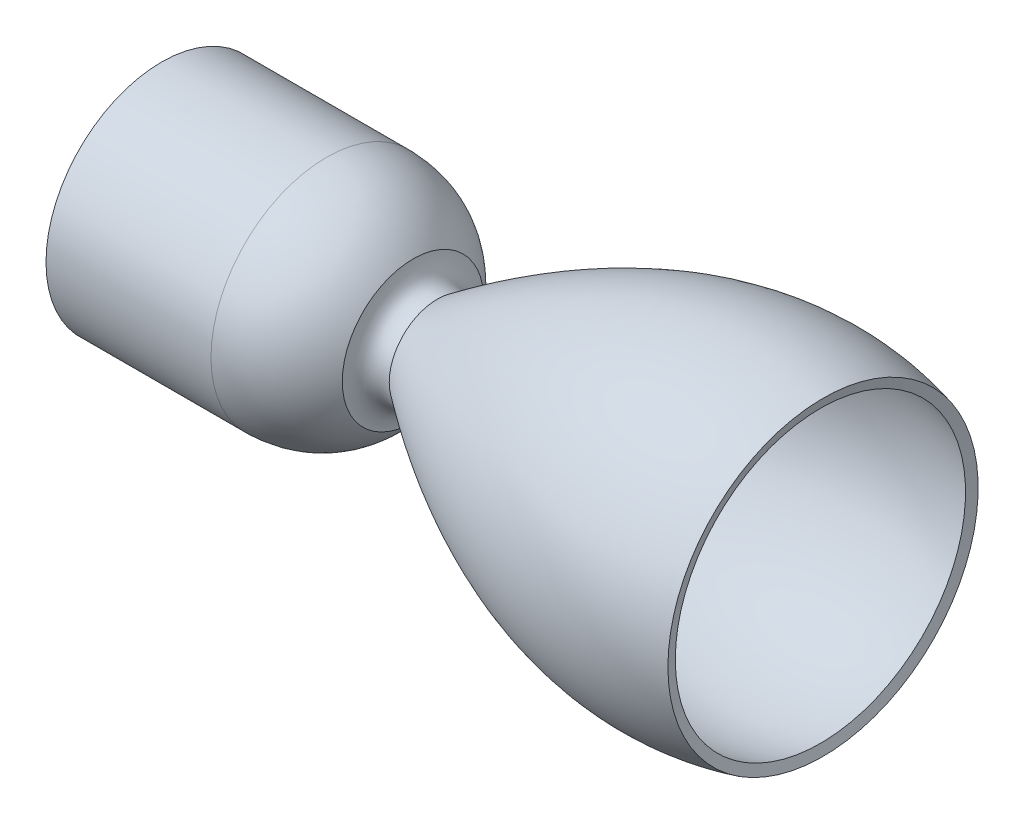
ISO-10303-21;
HEADER;
FILE_DESCRIPTION(('STEP AP214'),'2;1');
FILE_NAME('part.step','',(''),(''),'','','');
FILE_SCHEMA(('AUTOMOTIVE_DESIGN { 1 0 10303 214 1 1 1 1 }'));
ENDSEC;
DATA;
#1=APPLICATION_CONTEXT('core data for automotive mechanical design processes');
#2=APPLICATION_PROTOCOL_DEFINITION('international standard','automotive_design',2000,#1);
#3=PRODUCT_CONTEXT('',#1,'mechanical');
#4=PRODUCT('Part','Part','',(#3));
#5=PRODUCT_RELATED_PRODUCT_CATEGORY('part','',(#4));
#6=PRODUCT_DEFINITION_FORMATION('','',#4);
#7=PRODUCT_DEFINITION_CONTEXT('part definition',#1,'design');
#8=PRODUCT_DEFINITION('design','',#6,#7);
#9=PRODUCT_DEFINITION_SHAPE('','',#8);
#10=(LENGTH_UNIT() NAMED_UNIT(*) SI_UNIT(.MILLI.,.METRE.));
#11=(NAMED_UNIT(*) PLANE_ANGLE_UNIT() SI_UNIT($,.RADIAN.));
#12=(NAMED_UNIT(*) SI_UNIT($,.STERADIAN.) SOLID_ANGLE_UNIT());
#13=UNCERTAINTY_MEASURE_WITH_UNIT(LENGTH_MEASURE(1.E-05),#10,'distance_accuracy_value','');
#14=(GEOMETRIC_REPRESENTATION_CONTEXT(3) GLOBAL_UNCERTAINTY_ASSIGNED_CONTEXT((#13)) GLOBAL_UNIT_ASSIGNED_CONTEXT((#10,
#11,#12)) REPRESENTATION_CONTEXT('',''));
#15=CARTESIAN_POINT('',(0.,0.,0.));
#16=DIRECTION('',(0.,0.,1.));
#17=DIRECTION('',(1.,0.,0.));
#18=AXIS2_PLACEMENT_3D('',#15,#16,#17);
#19=CARTESIAN_POINT('',(0.756342142797396,-6.55923143450268,0.));
#20=CARTESIAN_POINT('',(9.29085510982509,-0.28152967443997,0.));
#21=CARTESIAN_POINT('',(17.6372134590099,4.96311359516636,0.));
#22=CARTESIAN_POINT('',(33.9400314015735,13.3980722203072,0.));
#23=CARTESIAN_POINT('',(41.8958674649053,16.588310473555,0.));
#24=CARTESIAN_POINT('',(57.4125183169419,20.9405057046258,0.));
#25=CARTESIAN_POINT('',(64.9726916829622,22.1033389698688,0.));
#26=CARTESIAN_POINT('',(79.7241808066635,22.4326491542779,0.));
#27=CARTESIAN_POINT('',(86.9166863426848,21.6002614700601,0.));
#28=CARTESIAN_POINT('',(93.9526164609345,19.7703088655652,0.));
#29=B_SPLINE_CURVE_WITH_KNOTS('',3,(#19,#20,#21,#22,#23,#24,#25,#26,#27,#28),.UNSPECIFIED.,.F.,
.F.,(4,2,2,2,4),(0.,0.25,0.5,0.75,1.),.UNSPECIFIED.);
#30=CARTESIAN_POINT('',(-113.110416619461,-15.8714739421003,0.));
#31=DIRECTION('',(-1.,0.,0.));
#32=AXIS1_PLACEMENT('',#30,#31);
#33=SURFACE_OF_REVOLUTION('',#29,#32);
#34=CARTESIAN_POINT('',(93.9526164609378,-15.8714739421003,0.));
#35=DIRECTION('',(-1.,0.,0.));
#36=DIRECTION('',(0.,0.,1.));
#37=AXIS2_PLACEMENT_3D('',#34,#35,#36);
#38=CIRCLE('',#37,35.641782807664);
#39=CARTESIAN_POINT('',(93.9526164609378,-15.8714739421003,35.641782807664));
#40=VERTEX_POINT('',#39);
#41=EDGE_CURVE('E10',#40,#40,#38,.T.);
#42=ORIENTED_EDGE('',*,*,#41,.F.);
#43=EDGE_LOOP('',(#42));
#44=FACE_BOUND('',#43,.T.);
#45=CARTESIAN_POINT('',(0.756342142794006,-15.8714739421003,0.));
#46=DIRECTION('',(-1.,0.,0.));
#47=DIRECTION('',(0.,0.,1.));
#48=AXIS2_PLACEMENT_3D('',#45,#46,#47);
#49=CIRCLE('',#48,9.31224250760099);
#50=CARTESIAN_POINT('',(0.756342142794006,-15.8714739421003,9.31224250760099));
#51=VERTEX_POINT('',#50);
#52=EDGE_CURVE('E87',#51,#51,#49,.T.);
#53=ORIENTED_EDGE('',*,*,#52,.T.);
#54=EDGE_LOOP('',(#53));
#55=FACE_BOUND('',#54,.T.);
#56=ADVANCED_FACE('F43',(#44,#55),#33,.T.);
#57=CARTESIAN_POINT('',(94.5919663228669,-15.8714739421003,0.));
#58=DIRECTION('',(1.,0.,0.));
#59=DIRECTION('',(0.,0.,-1.));
#60=AXIS2_PLACEMENT_3D('',#57,#58,#59);
#61=CONICAL_SURFACE('',#60,38.0999999978082,1.31634695877061);
#62=ORIENTED_EDGE('',*,*,#41,.T.);
#63=EDGE_LOOP('',(#62));
#64=FACE_BOUND('',#63,.T.);
#65=CARTESIAN_POINT('',(94.5919663228669,-15.8714739421003,0.));
#66=DIRECTION('',(-1.,0.,0.));
#67=DIRECTION('',(0.,0.,1.));
#68=AXIS2_PLACEMENT_3D('',#65,#66,#67);
#69=CIRCLE('',#68,38.0999999978082);
#70=CARTESIAN_POINT('',(94.5919663228669,-15.8714739421003,38.0999999978082));
#71=VERTEX_POINT('',#70);
#72=EDGE_CURVE('E51',#71,#71,#69,.T.);
#73=ORIENTED_EDGE('',*,*,#72,.F.);
#74=EDGE_LOOP('',(#73));
#75=FACE_BOUND('',#74,.T.);
#76=ADVANCED_FACE('F154',(#64,#75),#61,.F.);
#77=CARTESIAN_POINT('',(-175871.695879343,-984455.29880451,0.));
#78=CARTESIAN_POINT('',(163543.904104209,986574.295150785,0.));
#79=CARTESIAN_POINT('',(-150866.209475965,-988598.327745318,0.));
#80=B_SPLINE_CURVE_WITH_KNOTS('',2,(#77,#78,#79),.UNSPECIFIED.,.F.,.F.,(3,3),(0.,1.),.UNSPECIFIED.);
#81=CARTESIAN_POINT('',(-113.110416619461,-15.8714739421003,0.));
#82=DIRECTION('',(-1.,0.,0.));
#83=AXIS1_PLACEMENT('',#81,#82);
#84=SURFACE_OF_REVOLUTION('',#80,#83);
#85=ORIENTED_EDGE('',*,*,#72,.T.);
#86=EDGE_LOOP('',(#85));
#87=FACE_BOUND('',#86,.T.);
#88=CARTESIAN_POINT('',(-0.159634458701235,-15.8714739421003,0.));
#89=DIRECTION('',(-1.,0.,0.));
#90=DIRECTION('',(0.,0.,1.));
#91=AXIS2_PLACEMENT_3D('',#88,#89,#90);
#92=CIRCLE('',#91,11.7902146161757);
#93=CARTESIAN_POINT('',(-0.159634458701235,-15.8714739421003,11.7902146161757));
#94=VERTEX_POINT('',#93);
#95=EDGE_CURVE('E56',#94,#94,#92,.T.);
#96=ORIENTED_EDGE('',*,*,#95,.F.);
#97=EDGE_LOOP('',(#96));
#98=FACE_BOUND('',#97,.T.);
#99=ADVANCED_FACE('F152',(#87,#98),#84,.F.);
#100=CARTESIAN_POINT('',(-6.09269348657085,1.51528164538964,0.));
#101=CARTESIAN_POINT('',(-5.52771655934392,-4.48729548262409,0.));
#102=CARTESIAN_POINT('',(-0.159634458701233,-4.08125932592453,0.));
#103=B_SPLINE_CURVE_WITH_KNOTS('',2,(#100,#101,#102),.UNSPECIFIED.,.F.,.F.,(3,3),(0.,1.),.UNSPECIFIED.);
#104=CARTESIAN_POINT('',(-113.110416619461,-15.8714739421003,0.));
#105=DIRECTION('',(-1.,0.,0.));
#106=AXIS1_PLACEMENT('',#104,#105);
#107=SURFACE_OF_REVOLUTION('',#103,#106);
#108=ORIENTED_EDGE('',*,*,#95,.T.);
#109=EDGE_LOOP('',(#108));
#110=FACE_BOUND('',#109,.T.);
#111=CARTESIAN_POINT('',(-6.09269348657085,-15.8714739421003,0.));
#112=DIRECTION('',(-1.,0.,0.));
#113=DIRECTION('',(0.,0.,1.));
#114=AXIS2_PLACEMENT_3D('',#111,#112,#113);
#115=CIRCLE('',#114,17.3867555874899);
#116=CARTESIAN_POINT('',(-6.09269348657085,-15.8714739421003,17.3867555874899));
#117=VERTEX_POINT('',#116);
#118=EDGE_CURVE('E61',#117,#117,#115,.T.);
#119=ORIENTED_EDGE('',*,*,#118,.F.);
#120=EDGE_LOOP('',(#119));
#121=FACE_BOUND('',#120,.T.);
#122=ADVANCED_FACE('F126',(#110,#121),#107,.F.);
#123=CARTESIAN_POINT('',(-27.3360273158825,12.5149202102325,0.));
#124=CARTESIAN_POINT('',(-14.1805717322132,12.3503995452821,0.));
#125=CARTESIAN_POINT('',(-6.09269348657085,1.51528164538964,0.));
#126=B_SPLINE_CURVE_WITH_KNOTS('',2,(#123,#124,#125),.UNSPECIFIED.,.F.,.F.,(3,3),(0.,1.),.UNSPECIFIED.);
#127=CARTESIAN_POINT('',(-113.110416619461,-15.8714739421003,0.));
#128=DIRECTION('',(-1.,0.,0.));
#129=AXIS1_PLACEMENT('',#127,#128);
#130=SURFACE_OF_REVOLUTION('',#126,#129);
#131=ORIENTED_EDGE('',*,*,#118,.T.);
#132=EDGE_LOOP('',(#131));
#133=FACE_BOUND('',#132,.T.);
#134=CARTESIAN_POINT('',(-27.3360273158825,-15.8714739421003,0.));
#135=DIRECTION('',(-1.,0.,0.));
#136=DIRECTION('',(0.,0.,1.));
#137=AXIS2_PLACEMENT_3D('',#134,#135,#136);
#138=CIRCLE('',#137,28.3863941523328);
#139=CARTESIAN_POINT('',(-27.3360273158825,-15.8714739421003,28.3863941523328));
#140=VERTEX_POINT('',#139);
#141=EDGE_CURVE('E67',#140,#140,#138,.T.);
#142=ORIENTED_EDGE('',*,*,#141,.F.);
#143=EDGE_LOOP('',(#142));
#144=FACE_BOUND('',#143,.T.);
#145=ADVANCED_FACE('F122',(#133,#144),#130,.F.);
#146=CARTESIAN_POINT('',(-113.110416619461,-15.8714739421003,0.));
#147=DIRECTION('',(-1.,0.,0.));
#148=DIRECTION('',(0.,0.,1.));
#149=AXIS2_PLACEMENT_3D('',#146,#147,#148);
#150=CYLINDRICAL_SURFACE('',#149,28.3863941523328);
#151=ORIENTED_EDGE('',*,*,#141,.T.);
#152=EDGE_LOOP('',(#151));
#153=FACE_BOUND('',#152,.T.);
#154=CARTESIAN_POINT('',(-67.8593524229482,-15.8714739421003,0.));
#155=DIRECTION('',(-1.,0.,0.));
#156=DIRECTION('',(0.,0.,1.));
#157=AXIS2_PLACEMENT_3D('',#154,#155,#156);
#158=CIRCLE('',#157,28.3863941523328);
#159=CARTESIAN_POINT('',(-67.8593524229482,-15.8714739421003,28.3863941523328));
#160=VERTEX_POINT('',#159);
#161=EDGE_CURVE('E71',#160,#160,#158,.T.);
#162=ORIENTED_EDGE('',*,*,#161,.F.);
#163=EDGE_LOOP('',(#162));
#164=FACE_BOUND('',#163,.T.);
#165=ADVANCED_FACE('F118',(#153,#164),#150,.T.);
#166=CARTESIAN_POINT('',(-67.8593524229482,9.97492021023252,0.));
#167=DIRECTION('',(-1.,0.,0.));
#168=DIRECTION('',(0.,0.,1.));
#169=AXIS2_PLACEMENT_3D('',#166,#167,#168);
#170=PLANE('',#169);
#171=ORIENTED_EDGE('',*,*,#161,.T.);
#172=EDGE_LOOP('',(#171));
#173=FACE_BOUND('',#172,.T.);
#174=CARTESIAN_POINT('',(-67.8593524229482,-15.8714739421003,0.));
#175=DIRECTION('',(-1.,0.,0.));
#176=DIRECTION('',(0.,0.,1.));
#177=AXIS2_PLACEMENT_3D('',#174,#175,#176);
#178=CIRCLE('',#177,25.8463941523328);
#179=CARTESIAN_POINT('',(-67.8593524229482,-15.8714739421003,25.8463941523328));
#180=VERTEX_POINT('',#179);
#181=EDGE_CURVE('E75',#180,#180,#178,.T.);
#182=ORIENTED_EDGE('',*,*,#181,.F.);
#183=EDGE_LOOP('',(#182));
#184=FACE_BOUND('',#183,.T.);
#185=ADVANCED_FACE('F114',(#173,#184),#170,.T.);
#186=CARTESIAN_POINT('',(-113.110416619461,-15.8714739421003,0.));
#187=DIRECTION('',(-1.,0.,0.));
#188=DIRECTION('',(0.,0.,1.));
#189=AXIS2_PLACEMENT_3D('',#186,#187,#188);
#190=CYLINDRICAL_SURFACE('',#189,25.8463941523328);
#191=CARTESIAN_POINT('',(-27.3522348957007,-15.8714739421003,0.));
#192=DIRECTION('',(-1.,0.,0.));
#193=DIRECTION('',(0.,0.,1.));
#194=AXIS2_PLACEMENT_3D('',#191,#192,#193);
#195=CIRCLE('',#194,25.8463941523328);
#196=CARTESIAN_POINT('',(-27.3522348957007,-15.8714739421003,25.8463941523328));
#197=VERTEX_POINT('',#196);
#198=EDGE_CURVE('E79',#197,#197,#195,.T.);
#199=ORIENTED_EDGE('',*,*,#198,.F.);
#200=EDGE_LOOP('',(#199));
#201=FACE_BOUND('',#200,.T.);
#202=ORIENTED_EDGE('',*,*,#181,.T.);
#203=EDGE_LOOP('',(#202));
#204=FACE_BOUND('',#203,.T.);
#205=ADVANCED_FACE('F110',(#201,#204),#190,.F.);
#206=CARTESIAN_POINT('',(-27.3522348957007,9.97492021023252,0.));
#207=CARTESIAN_POINT('',(-25.3882180329702,9.94932964090427,0.));
#208=CARTESIAN_POINT('',(-23.5399653409365,9.73069885784314,0.));
#209=CARTESIAN_POINT('',(-20.0536406537601,8.9217059142993,0.));
#210=CARTESIAN_POINT('',(-18.4149610536497,8.33180800601734,0.));
#211=CARTESIAN_POINT('',(-15.3134128524904,6.77617230433151,0.));
#212=CARTESIAN_POINT('',(-13.8497548684766,5.80995363498895,0.));
#213=CARTESIAN_POINT('',(-11.0755486407139,3.47592101912139,0.));
#214=CARTESIAN_POINT('',(-9.765141762255,2.10740524236193,0.));
#215=CARTESIAN_POINT('',(-8.53198788400557,0.525363221255599,0.));
#216=B_SPLINE_CURVE_WITH_KNOTS('',3,(#206,#207,#208,#209,#210,#211,#212,#213,#214,#215),
.UNSPECIFIED.,.F.,.F.,(4,2,2,2,4),(0.,0.25,0.5,0.75,1.),.UNSPECIFIED.);
#217=CARTESIAN_POINT('',(-113.110416619461,-15.8714739421003,0.));
#218=DIRECTION('',(-1.,0.,0.));
#219=AXIS1_PLACEMENT('',#217,#218);
#220=SURFACE_OF_REVOLUTION('',#216,#219);
#221=CARTESIAN_POINT('',(-8.53198788400557,-15.8714739421003,0.));
#222=DIRECTION('',(-1.,0.,0.));
#223=DIRECTION('',(0.,0.,1.));
#224=AXIS2_PLACEMENT_3D('',#221,#222,#223);
#225=CIRCLE('',#224,16.3968371633559);
#226=CARTESIAN_POINT('',(-8.53198788400557,-15.8714739421003,16.3968371633559));
#227=VERTEX_POINT('',#226);
#228=EDGE_CURVE('E83',#227,#227,#225,.T.);
#229=ORIENTED_EDGE('',*,*,#228,.F.);
#230=EDGE_LOOP('',(#229));
#231=FACE_BOUND('',#230,.T.);
#232=ORIENTED_EDGE('',*,*,#198,.T.);
#233=EDGE_LOOP('',(#232));
#234=FACE_BOUND('',#233,.T.);
#235=ADVANCED_FACE('F106',(#231,#234),#220,.T.);
#236=CARTESIAN_POINT('',(-8.53198788400558,0.525363221255602,0.));
#237=CARTESIAN_POINT('',(-8.44720249487419,-0.0581733238958739,0.));
#238=CARTESIAN_POINT('',(-8.32836989810886,-0.619880587129045,0.));
#239=CARTESIAN_POINT('',(-8.00934648303191,-1.70046807829727,0.));
#240=CARTESIAN_POINT('',(-7.80893791652902,-2.21964573256806,0.));
#241=CARTESIAN_POINT('',(-7.31053605915429,-3.20554290017134,0.));
#242=CARTESIAN_POINT('',(-7.01192851696224,-3.67226635907586,0.));
#243=CARTESIAN_POINT('',(-6.31024080266694,-4.52607053540839,0.));
#244=CARTESIAN_POINT('',(-5.9068935603838,-4.91229224633136,0.));
#245=CARTESIAN_POINT('',(-5.01552511788134,-5.57192639758577,0.));
#246=CARTESIAN_POINT('',(-4.52842869944163,-5.84468701899989,0.));
#247=CARTESIAN_POINT('',(-3.50735984276247,-6.26680161416682,0.));
#248=CARTESIAN_POINT('',(-2.97408971334421,-6.41669062569942,0.));
#249=CARTESIAN_POINT('',(-1.88561053614078,-6.60788390240876,0.));
#250=CARTESIAN_POINT('',(-1.33019807601893,-6.64975513803352,0.));
#251=CARTESIAN_POINT('',(-0.624874642652453,-6.64611591577916,0.));
#252=CARTESIAN_POINT('',(-0.483222862463541,-6.64257963775158,0.));
#253=CARTESIAN_POINT('',(-0.269833654599379,-6.63323470212982,0.));
#254=CARTESIAN_POINT('',(-0.162910797183008,-6.62755180112534,0.));
#255=CARTESIAN_POINT('',(-0.0466973720100955,-6.61978531448299,0.));
#256=CARTESIAN_POINT('',(-0.00193806959399443,-6.61654260116483,0.));
#257=CARTESIAN_POINT('',(0.0159706157105068,-6.61522511527783,0.));
#258=CARTESIAN_POINT('',(0.0263933100879409,-6.61444400633726,0.));
#259=CARTESIAN_POINT('',(0.0476539557008088,-6.6128358731769,0.));
#260=CARTESIAN_POINT('',(0.288607939313316,-6.5946103640261,0.));
#261=CARTESIAN_POINT('',(0.529561922925817,-6.57638485487531,0.));
#262=CARTESIAN_POINT('',(0.756342142796408,-6.5592314344981,0.));
#263=B_SPLINE_CURVE_WITH_KNOTS('',3,(#236,#237,#238,#239,#240,#241,#242,#243,#244,#245,#246,
#247,#248,#249,#250,#251,#252,#253,#254,#255,#256,#257,#258,#259,#260,#261,#262),.UNSPECIFIED.,
.F.,.F.,(4,2,2,2,2,2,2,2,2,1,1,2,2,1,4),(0.,0.125,0.25,0.375,0.5,0.625,0.75,0.875,0.90625,
0.921875,0.9296875,0.931640625,0.93359375,0.9375,1.),.UNSPECIFIED.);
#264=CARTESIAN_POINT('',(-113.110416619461,-15.8714739421003,0.));
#265=DIRECTION('',(-1.,0.,0.));
#266=AXIS1_PLACEMENT('',#264,#265);
#267=SURFACE_OF_REVOLUTION('',#263,#266);
#268=ORIENTED_EDGE('',*,*,#52,.F.);
#269=EDGE_LOOP('',(#268));
#270=FACE_BOUND('',#269,.T.);
#271=ORIENTED_EDGE('',*,*,#228,.T.);
#272=EDGE_LOOP('',(#271));
#273=FACE_BOUND('',#272,.T.);
#274=ADVANCED_FACE('F103',(#270,#273),#267,.T.);
#275=CLOSED_SHELL('',(#56,#76,#99,#122,#145,#165,#185,#205,#235,#274));
#276=MANIFOLD_SOLID_BREP('B2',#275);
#277=ADVANCED_BREP_SHAPE_REPRESENTATION('',(#18,#276),#14);
#278=SHAPE_DEFINITION_REPRESENTATION(#9,#277);
ENDSEC;
END-ISO-10303-21;
